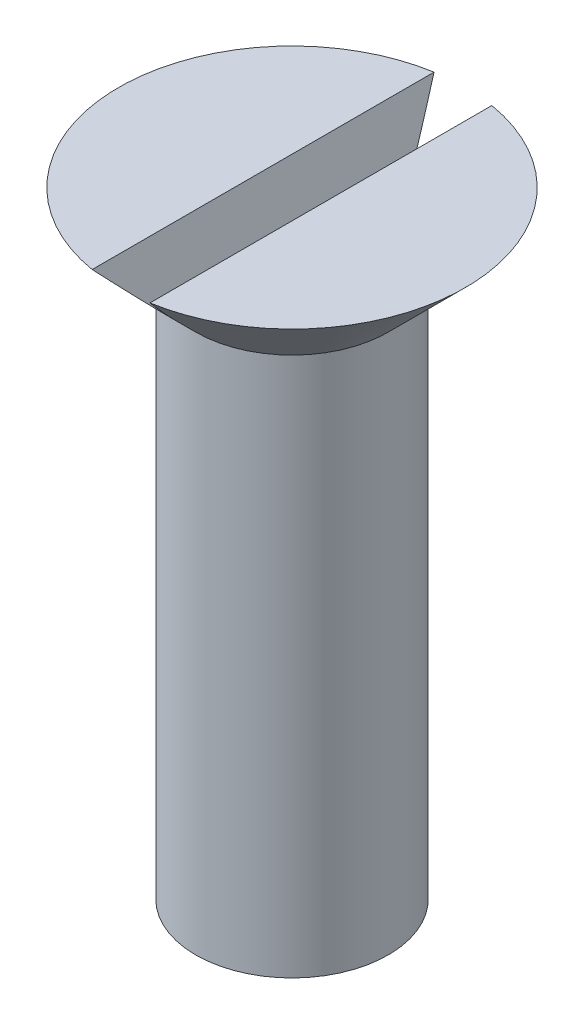
ISO-10303-21;
HEADER;
FILE_DESCRIPTION(('STEP AP214'),'2;1');
FILE_NAME('part.step','',(''),(''),'','','');
FILE_SCHEMA(('AUTOMOTIVE_DESIGN { 1 0 10303 214 1 1 1 1 }'));
ENDSEC;
DATA;
#1=APPLICATION_CONTEXT('core data for automotive mechanical design processes');
#2=APPLICATION_PROTOCOL_DEFINITION('international standard','automotive_design',2000,#1);
#3=PRODUCT_CONTEXT('',#1,'mechanical');
#4=PRODUCT('Part','Part','',(#3));
#5=PRODUCT_RELATED_PRODUCT_CATEGORY('part','',(#4));
#6=PRODUCT_DEFINITION_FORMATION('','',#4);
#7=PRODUCT_DEFINITION_CONTEXT('part definition',#1,'design');
#8=PRODUCT_DEFINITION('design','',#6,#7);
#9=PRODUCT_DEFINITION_SHAPE('','',#8);
#10=(LENGTH_UNIT() NAMED_UNIT(*) SI_UNIT(.MILLI.,.METRE.));
#11=(NAMED_UNIT(*) PLANE_ANGLE_UNIT() SI_UNIT($,.RADIAN.));
#12=(NAMED_UNIT(*) SI_UNIT($,.STERADIAN.) SOLID_ANGLE_UNIT());
#13=UNCERTAINTY_MEASURE_WITH_UNIT(LENGTH_MEASURE(1.E-05),#10,'distance_accuracy_value','');
#14=(GEOMETRIC_REPRESENTATION_CONTEXT(3) GLOBAL_UNCERTAINTY_ASSIGNED_CONTEXT((#13)) GLOBAL_UNIT_ASSIGNED_CONTEXT((#10,
#11,#12)) REPRESENTATION_CONTEXT('',''));
#15=CARTESIAN_POINT('',(0.,0.,0.));
#16=DIRECTION('',(0.,0.,1.));
#17=DIRECTION('',(1.,0.,0.));
#18=AXIS2_PLACEMENT_3D('',#15,#16,#17);
#19=CARTESIAN_POINT('',(0.,3.78098106712565,0.));
#20=DIRECTION('',(0.,-1.,0.));
#21=DIRECTION('',(0.,0.,-1.));
#22=AXIS2_PLACEMENT_3D('',#19,#20,#21);
#23=PLANE('',#22);
#24=CARTESIAN_POINT('',(0.,3.78098106712565,0.));
#25=DIRECTION('',(0.,1.,0.));
#26=DIRECTION('',(0.,0.,1.));
#27=AXIS2_PLACEMENT_3D('',#24,#25,#26);
#28=CIRCLE('',#27,4.50000000000001);
#29=CARTESIAN_POINT('',(0.75,3.78098106712565,4.43705983732472));
#30=VERTEX_POINT('',#29);
#31=CARTESIAN_POINT('',(0.75,3.78098106712565,-4.43705983732472));
#32=VERTEX_POINT('',#31);
#33=EDGE_CURVE('E81',#30,#32,#28,.T.);
#34=ORIENTED_EDGE('',*,*,#33,.T.);
#35=DIRECTION('',(0.,0.,1.));
#36=VECTOR('',#35,1.);
#37=CARTESIAN_POINT('',(0.75,3.78098106712565,-5.));
#38=LINE('',#37,#36);
#39=EDGE_CURVE('E126',#32,#30,#38,.T.);
#40=ORIENTED_EDGE('',*,*,#39,.T.);
#41=EDGE_LOOP('',(#34,#40));
#42=FACE_BOUND('',#41,.T.);
#43=ADVANCED_FACE('F31',(#42),#23,.F.);
#44=CARTESIAN_POINT('',(-0.75,3.78098106712565,-4.43705983732472));
#45=VERTEX_POINT('',#44);
#46=CARTESIAN_POINT('',(-0.75,3.78098106712565,4.43705983732472));
#47=VERTEX_POINT('',#46);
#48=EDGE_CURVE('E76',#45,#47,#28,.T.);
#49=ORIENTED_EDGE('',*,*,#48,.T.);
#50=DIRECTION('',(0.,0.,1.));
#51=VECTOR('',#50,1.);
#52=CARTESIAN_POINT('',(-0.75,3.78098106712565,-5.));
#53=LINE('',#52,#51);
#54=EDGE_CURVE('E50',#45,#47,#53,.T.);
#55=ORIENTED_EDGE('',*,*,#54,.F.);
#56=EDGE_LOOP('',(#49,#55));
#57=FACE_BOUND('',#56,.T.);
#58=ADVANCED_FACE('F33',(#57),#23,.F.);
#59=CARTESIAN_POINT('',(0.,1.78098106712567,0.));
#60=DIRECTION('',(0.,1.,0.));
#61=DIRECTION('',(0.,0.,1.));
#62=AXIS2_PLACEMENT_3D('',#59,#60,#61);
#63=CONICAL_SURFACE('',#62,2.50000000000001,0.785398163397451);
#64=CARTESIAN_POINT('',(-0.7501,3.78118106712565,-4.43724577074564));
#65=CARTESIAN_POINT('',(-0.686796309326077,3.65457368577781,-4.31952513361204));
#66=CARTESIAN_POINT('',(-0.623620221899803,3.52822151092526,-4.20145882542964));
#67=CARTESIAN_POINT('',(-0.497622212150751,3.27622549142716,-3.9644074604967));
#68=CARTESIAN_POINT('',(-0.434800263022005,3.15058159316966,-3.84542247494456));
#69=CARTESIAN_POINT('',(-0.309597199064813,2.90017546525528,-3.60628349326373));
#70=CARTESIAN_POINT('',(-0.247216102261506,2.77541327164867,-3.48612944980771));
#71=CARTESIAN_POINT('',(-0.123060161200093,2.52710138952584,-3.24424526803894));
#72=CARTESIAN_POINT('',(-0.0612853643969304,2.40355179591952,-3.12251500805854));
#73=CARTESIAN_POINT('',(9.9999999999793E-05,2.28078106712566,-2.99979999833322));
#74=B_SPLINE_CURVE_WITH_KNOTS('',3,(#64,#65,#66,#67,#68,#69,#70,#71,#72,#73),.UNSPECIFIED.,.F.,
.F.,(4,2,2,2,4),(0.,0.552319008622973,1.10459563327268,1.65689470972147,2.20923667515644),.UNSPECIFIED.);
#75=CARTESIAN_POINT('',(0.,2.28098106712565,-3.));
#76=VERTEX_POINT('',#75);
#77=EDGE_CURVE('E43',#45,#76,#74,.T.);
#78=ORIENTED_EDGE('',*,*,#77,.T.);
#79=CARTESIAN_POINT('',(-0.000100000000000057,2.28078106712565,-2.99979999833322));
#80=CARTESIAN_POINT('',(0.0612853643969302,2.40355179591952,-3.12251500805854));
#81=CARTESIAN_POINT('',(0.123060161200093,2.52710138952584,-3.24424526803894));
#82=CARTESIAN_POINT('',(0.247216102261506,2.77541327164867,-3.48612944980771));
#83=CARTESIAN_POINT('',(0.309597199064813,2.90017546525528,-3.60628349326373));
#84=CARTESIAN_POINT('',(0.434800263022005,3.15058159316966,-3.84542247494456));
#85=CARTESIAN_POINT('',(0.497622212150751,3.27622549142716,-3.9644074604967));
#86=CARTESIAN_POINT('',(0.623620221899803,3.52822151092526,-4.20145882542964));
#87=CARTESIAN_POINT('',(0.686796309326078,3.65457368577781,-4.31952513361204));
#88=CARTESIAN_POINT('',(0.7501,3.78118106712566,-4.43724577074564));
#89=B_SPLINE_CURVE_WITH_KNOTS('',3,(#79,#80,#81,#82,#83,#84,#85,#86,#87,#88),.UNSPECIFIED.,.F.,
.F.,(4,2,2,2,4),(0.,0.552341965434973,1.10464104188377,1.65691766653347,2.20923667515644),.UNSPECIFIED.);
#90=EDGE_CURVE('E11',#76,#32,#89,.T.);
#91=ORIENTED_EDGE('',*,*,#90,.T.);
#92=ORIENTED_EDGE('',*,*,#33,.F.);
#93=CARTESIAN_POINT('',(0.7501,3.78118106712565,4.43724577074564));
#94=CARTESIAN_POINT('',(0.686796309326078,3.65457368577781,4.31952513361204));
#95=CARTESIAN_POINT('',(0.623620221899803,3.52822151092526,4.20145882542964));
#96=CARTESIAN_POINT('',(0.497622212150751,3.27622549142716,3.9644074604967));
#97=CARTESIAN_POINT('',(0.434800263022005,3.15058159316966,3.84542247494456));
#98=CARTESIAN_POINT('',(0.309597199064813,2.90017546525528,3.60628349326373));
#99=CARTESIAN_POINT('',(0.247216102261506,2.77541327164867,3.48612944980771));
#100=CARTESIAN_POINT('',(0.123060161200093,2.52710138952584,3.24424526803894));
#101=CARTESIAN_POINT('',(0.0612853643969305,2.40355179591952,3.12251500805854));
#102=CARTESIAN_POINT('',(-9.99999999998004E-05,2.28078106712566,2.99979999833322));
#103=B_SPLINE_CURVE_WITH_KNOTS('',3,(#93,#94,#95,#96,#97,#98,#99,#100,#101,#102),.UNSPECIFIED.,
.F.,.F.,(4,2,2,2,4),(0.,0.552319008622974,1.10459563327268,1.65689470972147,2.20923667515644),.UNSPECIFIED.);
#104=CARTESIAN_POINT('',(0.,2.28098106712565,3.));
#105=VERTEX_POINT('',#104);
#106=EDGE_CURVE('E58',#30,#105,#103,.T.);
#107=ORIENTED_EDGE('',*,*,#106,.T.);
#108=CARTESIAN_POINT('',(0.000100000000000111,2.28078106712565,2.99979999833322));
#109=CARTESIAN_POINT('',(-0.0612853643969301,2.40355179591952,3.12251500805854));
#110=CARTESIAN_POINT('',(-0.123060161200093,2.52710138952584,3.24424526803894));
#111=CARTESIAN_POINT('',(-0.247216102261506,2.77541327164867,3.48612944980771));
#112=CARTESIAN_POINT('',(-0.309597199064813,2.90017546525528,3.60628349326373));
#113=CARTESIAN_POINT('',(-0.434800263022005,3.15058159316966,3.84542247494456));
#114=CARTESIAN_POINT('',(-0.497622212150751,3.27622549142716,3.9644074604967));
#115=CARTESIAN_POINT('',(-0.623620221899803,3.52822151092526,4.20145882542964));
#116=CARTESIAN_POINT('',(-0.686796309326078,3.65457368577781,4.31952513361204));
#117=CARTESIAN_POINT('',(-0.7501,3.78118106712566,4.43724577074564));
#118=B_SPLINE_CURVE_WITH_KNOTS('',3,(#108,#109,#110,#111,#112,#113,#114,#115,#116,#117),
.UNSPECIFIED.,.F.,.F.,(4,2,2,2,4),(0.,0.552341965434973,1.10464104188377,1.65691766653347,
2.20923667515644),.UNSPECIFIED.);
#119=EDGE_CURVE('E80',#105,#47,#118,.T.);
#120=ORIENTED_EDGE('',*,*,#119,.T.);
#121=ORIENTED_EDGE('',*,*,#48,.F.);
#122=EDGE_LOOP('',(#78,#91,#92,#107,#120,#121));
#123=FACE_BOUND('',#122,.T.);
#124=CARTESIAN_POINT('',(0.,1.78098106712567,0.));
#125=DIRECTION('',(0.,1.,0.));
#126=DIRECTION('',(0.,0.,1.));
#127=AXIS2_PLACEMENT_3D('',#124,#125,#126);
#128=CIRCLE('',#127,2.50000000000001);
#129=CARTESIAN_POINT('',(0.,1.78098106712567,2.50000000000001));
#130=VERTEX_POINT('',#129);
#131=EDGE_CURVE('E82',#130,#130,#128,.T.);
#132=ORIENTED_EDGE('',*,*,#131,.T.);
#133=EDGE_LOOP('',(#132));
#134=FACE_BOUND('',#133,.T.);
#135=ADVANCED_FACE('F78',(#123,#134),#63,.T.);
#136=CARTESIAN_POINT('',(0.,84.539156626506,0.));
#137=DIRECTION('',(0.,1.,0.));
#138=DIRECTION('',(0.,0.,1.));
#139=AXIS2_PLACEMENT_3D('',#136,#137,#138);
#140=CYLINDRICAL_SURFACE('',#139,2.50000000000001);
#141=ORIENTED_EDGE('',*,*,#131,.F.);
#142=EDGE_LOOP('',(#141));
#143=FACE_BOUND('',#142,.T.);
#144=CARTESIAN_POINT('',(0.,-12.2190189328743,0.));
#145=DIRECTION('',(0.,1.,0.));
#146=DIRECTION('',(0.,0.,1.));
#147=AXIS2_PLACEMENT_3D('',#144,#145,#146);
#148=CIRCLE('',#147,2.50000000000001);
#149=CARTESIAN_POINT('',(0.,-12.2190189328743,2.50000000000001));
#150=VERTEX_POINT('',#149);
#151=EDGE_CURVE('E86',#150,#150,#148,.T.);
#152=ORIENTED_EDGE('',*,*,#151,.T.);
#153=EDGE_LOOP('',(#152));
#154=FACE_BOUND('',#153,.T.);
#155=ADVANCED_FACE('F111',(#143,#154),#140,.T.);
#156=CARTESIAN_POINT('',(2.50000000000001,-12.2190189328743,0.));
#157=DIRECTION('',(0.,1.,0.));
#158=DIRECTION('',(0.,0.,1.));
#159=AXIS2_PLACEMENT_3D('',#156,#157,#158);
#160=PLANE('',#159);
#161=ORIENTED_EDGE('',*,*,#151,.F.);
#162=EDGE_LOOP('',(#161));
#163=FACE_BOUND('',#162,.T.);
#164=ADVANCED_FACE('F105',(#163),#160,.F.);
#165=CARTESIAN_POINT('',(0.,2.28098106712565,-5.));
#166=DIRECTION('',(0.894427190999916,-0.447213595499958,0.));
#167=DIRECTION('',(0.447213595499958,0.894427190999916,0.));
#168=AXIS2_PLACEMENT_3D('',#165,#166,#167);
#169=PLANE('',#168);
#170=ORIENTED_EDGE('',*,*,#39,.F.);
#171=ORIENTED_EDGE('',*,*,#90,.F.);
#172=DIRECTION('',(0.,0.,1.));
#173=VECTOR('',#172,1.);
#174=CARTESIAN_POINT('',(0.,2.28098106712565,-5.));
#175=LINE('',#174,#173);
#176=EDGE_CURVE('E71',#76,#105,#175,.T.);
#177=ORIENTED_EDGE('',*,*,#176,.T.);
#178=ORIENTED_EDGE('',*,*,#106,.F.);
#179=EDGE_LOOP('',(#170,#171,#177,#178));
#180=FACE_BOUND('',#179,.T.);
#181=ADVANCED_FACE('F103',(#180),#169,.F.);
#182=CARTESIAN_POINT('',(-0.75,3.78098106712565,-5.));
#183=DIRECTION('',(-0.894427190999916,-0.447213595499958,0.));
#184=DIRECTION('',(0.447213595499958,-0.894427190999916,0.));
#185=AXIS2_PLACEMENT_3D('',#182,#183,#184);
#186=PLANE('',#185);
#187=ORIENTED_EDGE('',*,*,#54,.T.);
#188=ORIENTED_EDGE('',*,*,#119,.F.);
#189=ORIENTED_EDGE('',*,*,#176,.F.);
#190=ORIENTED_EDGE('',*,*,#77,.F.);
#191=EDGE_LOOP('',(#187,#188,#189,#190));
#192=FACE_BOUND('',#191,.T.);
#193=ADVANCED_FACE('F70',(#192),#186,.F.);
#194=CLOSED_SHELL('',(#43,#58,#135,#155,#164,#181,#193));
#195=MANIFOLD_SOLID_BREP('B2',#194);
#196=ADVANCED_BREP_SHAPE_REPRESENTATION('',(#18,#195),#14);
#197=SHAPE_DEFINITION_REPRESENTATION(#9,#196);
ENDSEC;
END-ISO-10303-21;
